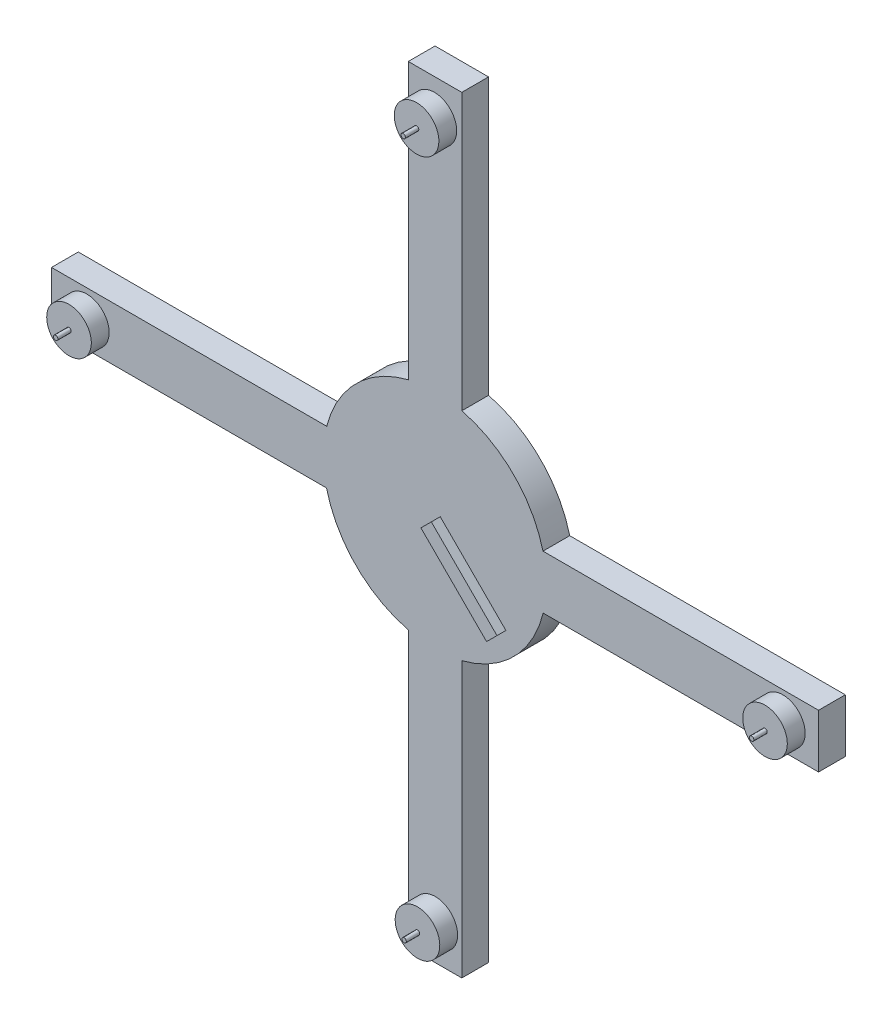
ISO-10303-21;
HEADER;
FILE_DESCRIPTION(('STEP AP214'),'2;1');
FILE_NAME('part.step','',(''),(''),'','','');
FILE_SCHEMA(('AUTOMOTIVE_DESIGN { 1 0 10303 214 1 1 1 1 }'));
ENDSEC;
DATA;
#1=APPLICATION_CONTEXT('core data for automotive mechanical design processes');
#2=APPLICATION_PROTOCOL_DEFINITION('international standard','automotive_design',2000,#1);
#3=PRODUCT_CONTEXT('',#1,'mechanical');
#4=PRODUCT('Part','Part','',(#3));
#5=PRODUCT_RELATED_PRODUCT_CATEGORY('part','',(#4));
#6=PRODUCT_DEFINITION_FORMATION('','',#4);
#7=PRODUCT_DEFINITION_CONTEXT('part definition',#1,'design');
#8=PRODUCT_DEFINITION('design','',#6,#7);
#9=PRODUCT_DEFINITION_SHAPE('','',#8);
#10=(LENGTH_UNIT() NAMED_UNIT(*) SI_UNIT(.MILLI.,.METRE.));
#11=(NAMED_UNIT(*) PLANE_ANGLE_UNIT() SI_UNIT($,.RADIAN.));
#12=(NAMED_UNIT(*) SI_UNIT($,.STERADIAN.) SOLID_ANGLE_UNIT());
#13=UNCERTAINTY_MEASURE_WITH_UNIT(LENGTH_MEASURE(1.E-05),#10,'distance_accuracy_value','');
#14=(GEOMETRIC_REPRESENTATION_CONTEXT(3) GLOBAL_UNCERTAINTY_ASSIGNED_CONTEXT((#13)) GLOBAL_UNIT_ASSIGNED_CONTEXT((#10,
#11,#12)) REPRESENTATION_CONTEXT('',''));
#15=CARTESIAN_POINT('',(0.,0.,0.));
#16=DIRECTION('',(0.,0.,1.));
#17=DIRECTION('',(1.,0.,0.));
#18=AXIS2_PLACEMENT_3D('',#15,#16,#17);
#19=CARTESIAN_POINT('',(0.,0.,15.));
#20=DIRECTION('',(0.,0.,1.));
#21=DIRECTION('',(1.,0.,0.));
#22=AXIS2_PLACEMENT_3D('',#19,#20,#21);
#23=PLANE('',#22);
#24=CARTESIAN_POINT('',(0.308153891719877,-390.724079491612,15.));
#25=DIRECTION('',(0.,0.,1.));
#26=DIRECTION('',(0.,-1.,0.));
#27=AXIS2_PLACEMENT_3D('',#24,#25,#26);
#28=CIRCLE('',#27,25.);
#29=CARTESIAN_POINT('',(0.308153891720139,-415.724079491612,15.));
#30=VERTEX_POINT('',#29);
#31=EDGE_CURVE('E218',#30,#30,#28,.T.);
#32=ORIENTED_EDGE('',*,*,#31,.F.);
#33=EDGE_LOOP('',(#32));
#34=FACE_BOUND('',#33,.T.);
#35=CARTESIAN_POINT('',(-390.415925599896,-1.03223338332725,15.));
#36=DIRECTION('',(0.,0.,1.));
#37=DIRECTION('',(-1.,0.,0.));
#38=AXIS2_PLACEMENT_3D('',#35,#36,#37);
#39=CIRCLE('',#38,25.);
#40=CARTESIAN_POINT('',(-415.415925599896,-1.03223338332725,15.));
#41=VERTEX_POINT('',#40);
#42=EDGE_CURVE('E224',#41,#41,#39,.T.);
#43=ORIENTED_EDGE('',*,*,#42,.F.);
#44=EDGE_LOOP('',(#43));
#45=FACE_BOUND('',#44,.T.);
#46=CARTESIAN_POINT('',(-0.724079491612825,389.691846108284,15.));
#47=DIRECTION('',(0.,0.,1.));
#48=DIRECTION('',(0.,1.,0.));
#49=AXIS2_PLACEMENT_3D('',#46,#47,#48);
#50=CIRCLE('',#49,25.);
#51=CARTESIAN_POINT('',(-0.724079491612912,414.691846108284,15.));
#52=VERTEX_POINT('',#51);
#53=EDGE_CURVE('E230',#52,#52,#50,.T.);
#54=ORIENTED_EDGE('',*,*,#53,.F.);
#55=EDGE_LOOP('',(#54));
#56=FACE_BOUND('',#55,.T.);
#57=CARTESIAN_POINT('',(390.,0.,15.));
#58=DIRECTION('',(0.,0.,1.));
#59=DIRECTION('',(1.,0.,0.));
#60=AXIS2_PLACEMENT_3D('',#57,#58,#59);
#61=CIRCLE('',#60,25.);
#62=CARTESIAN_POINT('',(415.,0.,15.));
#63=VERTEX_POINT('',#62);
#64=EDGE_CURVE('E242',#63,#63,#61,.T.);
#65=ORIENTED_EDGE('',*,*,#64,.F.);
#66=EDGE_LOOP('',(#65));
#67=FACE_BOUND('',#66,.T.);
#68=CARTESIAN_POINT('',(-0.207962799947836,-0.516116691663626,15.));
#69=DIRECTION('',(0.,0.,1.));
#70=DIRECTION('',(1.,0.,0.));
#71=AXIS2_PLACEMENT_3D('',#68,#69,#70);
#72=CIRCLE('',#71,125.);
#73=CARTESIAN_POINT('',(-121.681007649661,-30.,15.));
#74=VERTEX_POINT('',#73);
#75=CARTESIAN_POINT('',(-30.,-121.91395241978,15.));
#76=VERTEX_POINT('',#75);
#77=EDGE_CURVE('E248',#74,#76,#72,.T.);
#78=ORIENTED_EDGE('',*,*,#77,.T.);
#79=DIRECTION('',(0.,1.,0.));
#80=VECTOR('',#79,1.);
#81=CARTESIAN_POINT('',(-30.,0.,15.));
#82=LINE('',#81,#80);
#83=CARTESIAN_POINT('',(-30.,-430.,15.));
#84=VERTEX_POINT('',#83);
#85=EDGE_CURVE('E253',#84,#76,#82,.T.);
#86=ORIENTED_EDGE('',*,*,#85,.F.);
#87=DIRECTION('',(-1.,0.,0.));
#88=VECTOR('',#87,1.);
#89=CARTESIAN_POINT('',(0.,-430.,15.));
#90=LINE('',#89,#88);
#91=CARTESIAN_POINT('',(30.,-430.,15.));
#92=VERTEX_POINT('',#91);
#93=EDGE_CURVE('E256',#92,#84,#90,.T.);
#94=ORIENTED_EDGE('',*,*,#93,.F.);
#95=DIRECTION('',(0.,-1.,0.));
#96=VECTOR('',#95,1.);
#97=CARTESIAN_POINT('',(30.,0.,15.));
#98=LINE('',#97,#96);
#99=CARTESIAN_POINT('',(30.,-121.811124764861,15.));
#100=VERTEX_POINT('',#99);
#101=EDGE_CURVE('E259',#100,#92,#98,.T.);
#102=ORIENTED_EDGE('',*,*,#101,.F.);
#103=CARTESIAN_POINT('',(-0.207962799947836,-0.516116691663626,15.));
#104=DIRECTION('',(0.,0.,1.));
#105=DIRECTION('',(1.,0.,0.));
#106=AXIS2_PLACEMENT_3D('',#103,#104,#105);
#107=CIRCLE('',#106,125.);
#108=CARTESIAN_POINT('',(121.265082049765,-30.,15.));
#109=VERTEX_POINT('',#108);
#110=EDGE_CURVE('E262',#100,#109,#107,.T.);
#111=ORIENTED_EDGE('',*,*,#110,.T.);
#112=DIRECTION('',(-1.,0.,0.));
#113=VECTOR('',#112,1.);
#114=CARTESIAN_POINT('',(0.,-30.,15.));
#115=LINE('',#114,#113);
#116=CARTESIAN_POINT('',(430.,-30.,15.));
#117=VERTEX_POINT('',#116);
#118=EDGE_CURVE('E265',#117,#109,#115,.T.);
#119=ORIENTED_EDGE('',*,*,#118,.F.);
#120=DIRECTION('',(0.,-1.,0.));
#121=VECTOR('',#120,1.);
#122=CARTESIAN_POINT('',(430.,0.,15.));
#123=LINE('',#122,#121);
#124=CARTESIAN_POINT('',(430.,30.,15.));
#125=VERTEX_POINT('',#124);
#126=EDGE_CURVE('E268',#125,#117,#123,.T.);
#127=ORIENTED_EDGE('',*,*,#126,.F.);
#128=DIRECTION('',(1.,0.,0.));
#129=VECTOR('',#128,1.);
#130=CARTESIAN_POINT('',(0.,30.,15.));
#131=LINE('',#130,#129);
#132=CARTESIAN_POINT('',(121.00988498684,30.,15.));
#133=VERTEX_POINT('',#132);
#134=EDGE_CURVE('E271',#133,#125,#131,.T.);
#135=ORIENTED_EDGE('',*,*,#134,.F.);
#136=CARTESIAN_POINT('',(-0.207962799947836,-0.516116691663626,15.));
#137=DIRECTION('',(0.,0.,1.));
#138=DIRECTION('',(1.,0.,0.));
#139=AXIS2_PLACEMENT_3D('',#136,#137,#138);
#140=CIRCLE('',#139,125.);
#141=CARTESIAN_POINT('',(30.,120.778891381534,15.));
#142=VERTEX_POINT('',#141);
#143=EDGE_CURVE('E274',#133,#142,#140,.T.);
#144=ORIENTED_EDGE('',*,*,#143,.T.);
#145=DIRECTION('',(0.,-1.,0.));
#146=VECTOR('',#145,1.);
#147=CARTESIAN_POINT('',(30.,0.,15.));
#148=LINE('',#147,#146);
#149=CARTESIAN_POINT('',(30.,430.,15.));
#150=VERTEX_POINT('',#149);
#151=EDGE_CURVE('E277',#150,#142,#148,.T.);
#152=ORIENTED_EDGE('',*,*,#151,.F.);
#153=DIRECTION('',(1.,0.,0.));
#154=VECTOR('',#153,1.);
#155=CARTESIAN_POINT('',(0.,430.,15.));
#156=LINE('',#155,#154);
#157=CARTESIAN_POINT('',(-30.,430.,15.));
#158=VERTEX_POINT('',#157);
#159=EDGE_CURVE('E280',#158,#150,#156,.T.);
#160=ORIENTED_EDGE('',*,*,#159,.F.);
#161=DIRECTION('',(0.,1.,0.));
#162=VECTOR('',#161,1.);
#163=CARTESIAN_POINT('',(-30.,0.,15.));
#164=LINE('',#163,#162);
#165=CARTESIAN_POINT('',(-30.,120.881719036453,15.));
#166=VERTEX_POINT('',#165);
#167=EDGE_CURVE('E283',#166,#158,#164,.T.);
#168=ORIENTED_EDGE('',*,*,#167,.F.);
#169=CARTESIAN_POINT('',(-0.207962799947836,-0.516116691663626,15.));
#170=DIRECTION('',(0.,0.,1.));
#171=DIRECTION('',(1.,0.,0.));
#172=AXIS2_PLACEMENT_3D('',#169,#170,#171);
#173=CIRCLE('',#172,125.);
#174=CARTESIAN_POINT('',(-121.425810586735,30.,15.));
#175=VERTEX_POINT('',#174);
#176=EDGE_CURVE('E286',#166,#175,#173,.T.);
#177=ORIENTED_EDGE('',*,*,#176,.T.);
#178=DIRECTION('',(1.,0.,0.));
#179=VECTOR('',#178,1.);
#180=CARTESIAN_POINT('',(0.,30.,15.));
#181=LINE('',#180,#179);
#182=CARTESIAN_POINT('',(-430.,30.,15.));
#183=VERTEX_POINT('',#182);
#184=EDGE_CURVE('E289',#183,#175,#181,.T.);
#185=ORIENTED_EDGE('',*,*,#184,.F.);
#186=DIRECTION('',(0.,1.,0.));
#187=VECTOR('',#186,1.);
#188=CARTESIAN_POINT('',(-430.,0.,15.));
#189=LINE('',#188,#187);
#190=CARTESIAN_POINT('',(-430.,-30.,15.));
#191=VERTEX_POINT('',#190);
#192=EDGE_CURVE('E292',#191,#183,#189,.T.);
#193=ORIENTED_EDGE('',*,*,#192,.F.);
#194=DIRECTION('',(-1.,0.,0.));
#195=VECTOR('',#194,1.);
#196=CARTESIAN_POINT('',(0.,-30.,15.));
#197=LINE('',#196,#195);
#198=EDGE_CURVE('E295',#74,#191,#197,.T.);
#199=ORIENTED_EDGE('',*,*,#198,.F.);
#200=EDGE_LOOP('',(#78,#86,#94,#102,#111,#119,#127,#135,#144,#152,#160,#168,#177,#185,#193,#199));
#201=FACE_BOUND('',#200,.T.);
#202=DIRECTION('',(0.707106781186551,-0.707106781186544,0.));
#203=VECTOR('',#202,1.);
#204=CARTESIAN_POINT('',(-5.83466475817812,-5.83466475817819,15.));
#205=LINE('',#204,#203);
#206=CARTESIAN_POINT('',(-5.83466475817812,-5.83466475817819,15.));
#207=VERTEX_POINT('',#206);
#208=CARTESIAN_POINT('',(67.7881231764963,-79.4574526928518,15.));
#209=VERTEX_POINT('',#208);
#210=EDGE_CURVE('E714',#207,#209,#205,.T.);
#211=ORIENTED_EDGE('',*,*,#210,.F.);
#212=DIRECTION('',(-0.707106781186543,-0.707106781186552,0.));
#213=VECTOR('',#212,1.);
#214=CARTESIAN_POINT('',(-5.83466475817812,-5.83466475817819,15.));
#215=LINE('',#214,#213);
#216=CARTESIAN_POINT('',(5.83466475817812,5.83466475817819,15.));
#217=VERTEX_POINT('',#216);
#218=EDGE_CURVE('E196',#217,#207,#215,.T.);
#219=ORIENTED_EDGE('',*,*,#218,.F.);
#220=DIRECTION('',(-0.707106781186552,0.707106781186543,0.));
#221=VECTOR('',#220,1.);
#222=CARTESIAN_POINT('',(5.83466475817812,5.83466475817819,15.));
#223=LINE('',#222,#221);
#224=CARTESIAN_POINT('',(79.4574526928526,-67.7881231764954,15.));
#225=VERTEX_POINT('',#224);
#226=EDGE_CURVE('E192',#225,#217,#223,.T.);
#227=ORIENTED_EDGE('',*,*,#226,.F.);
#228=DIRECTION('',(0.707106781186543,0.707106781186552,0.));
#229=VECTOR('',#228,1.);
#230=CARTESIAN_POINT('',(67.7881231764963,-79.4574526928518,15.));
#231=LINE('',#230,#229);
#232=EDGE_CURVE('E711',#209,#225,#231,.T.);
#233=ORIENTED_EDGE('',*,*,#232,.F.);
#234=EDGE_LOOP('',(#211,#219,#227,#233));
#235=FACE_BOUND('',#234,.T.);
#236=ADVANCED_FACE('F35',(#34,#45,#56,#67,#201,#235),#23,.T.);
#237=CARTESIAN_POINT('',(-0.207962799947836,-0.516116691663626,-15.));
#238=DIRECTION('',(0.,0.,1.));
#239=DIRECTION('',(1.,0.,0.));
#240=AXIS2_PLACEMENT_3D('',#237,#238,#239);
#241=CYLINDRICAL_SURFACE('',#240,125.);
#242=DIRECTION('',(0.,0.,1.));
#243=VECTOR('',#242,1.);
#244=CARTESIAN_POINT('',(-30.,-121.91395241978,-15.));
#245=LINE('',#244,#243);
#246=CARTESIAN_POINT('',(-30.,-121.91395241978,-15.));
#247=VERTEX_POINT('',#246);
#248=EDGE_CURVE('E39',#247,#76,#245,.T.);
#249=ORIENTED_EDGE('',*,*,#248,.T.);
#250=ORIENTED_EDGE('',*,*,#77,.F.);
#251=DIRECTION('',(0.,0.,1.));
#252=VECTOR('',#251,1.);
#253=CARTESIAN_POINT('',(-121.681007649661,-30.,-15.));
#254=LINE('',#253,#252);
#255=CARTESIAN_POINT('',(-121.681007649661,-30.,-15.));
#256=VERTEX_POINT('',#255);
#257=EDGE_CURVE('E11',#256,#74,#254,.T.);
#258=ORIENTED_EDGE('',*,*,#257,.F.);
#259=CARTESIAN_POINT('',(-0.207962799947836,-0.516116691663626,-15.));
#260=DIRECTION('',(0.,0.,1.));
#261=DIRECTION('',(1.,0.,0.));
#262=AXIS2_PLACEMENT_3D('',#259,#260,#261);
#263=CIRCLE('',#262,125.);
#264=EDGE_CURVE('E298',#256,#247,#263,.T.);
#265=ORIENTED_EDGE('',*,*,#264,.T.);
#266=EDGE_LOOP('',(#249,#250,#258,#265));
#267=FACE_BOUND('',#266,.T.);
#268=ADVANCED_FACE('F37',(#267),#241,.T.);
#269=CARTESIAN_POINT('',(0.,-30.,-15.));
#270=DIRECTION('',(0.,1.,0.));
#271=DIRECTION('',(0.,0.,1.));
#272=AXIS2_PLACEMENT_3D('',#269,#270,#271);
#273=PLANE('',#272);
#274=ORIENTED_EDGE('',*,*,#257,.T.);
#275=ORIENTED_EDGE('',*,*,#198,.T.);
#276=DIRECTION('',(0.,0.,1.));
#277=VECTOR('',#276,1.);
#278=CARTESIAN_POINT('',(-430.,-30.,-15.));
#279=LINE('',#278,#277);
#280=CARTESIAN_POINT('',(-430.,-30.,-15.));
#281=VERTEX_POINT('',#280);
#282=EDGE_CURVE('E44',#281,#191,#279,.T.);
#283=ORIENTED_EDGE('',*,*,#282,.F.);
#284=DIRECTION('',(-1.,0.,0.));
#285=VECTOR('',#284,1.);
#286=CARTESIAN_POINT('',(0.,-30.,-15.));
#287=LINE('',#286,#285);
#288=EDGE_CURVE('E331',#256,#281,#287,.T.);
#289=ORIENTED_EDGE('',*,*,#288,.F.);
#290=EDGE_LOOP('',(#274,#275,#283,#289));
#291=FACE_BOUND('',#290,.T.);
#292=ADVANCED_FACE('F389',(#291),#273,.F.);
#293=CARTESIAN_POINT('',(-430.,0.,-15.));
#294=DIRECTION('',(1.,0.,0.));
#295=DIRECTION('',(0.,0.,-1.));
#296=AXIS2_PLACEMENT_3D('',#293,#294,#295);
#297=PLANE('',#296);
#298=ORIENTED_EDGE('',*,*,#282,.T.);
#299=ORIENTED_EDGE('',*,*,#192,.T.);
#300=DIRECTION('',(0.,0.,1.));
#301=VECTOR('',#300,1.);
#302=CARTESIAN_POINT('',(-430.,30.,-15.));
#303=LINE('',#302,#301);
#304=CARTESIAN_POINT('',(-430.,30.,-15.));
#305=VERTEX_POINT('',#304);
#306=EDGE_CURVE('E334',#305,#183,#303,.T.);
#307=ORIENTED_EDGE('',*,*,#306,.F.);
#308=DIRECTION('',(0.,1.,0.));
#309=VECTOR('',#308,1.);
#310=CARTESIAN_POINT('',(-430.,0.,-15.));
#311=LINE('',#310,#309);
#312=EDGE_CURVE('E329',#281,#305,#311,.T.);
#313=ORIENTED_EDGE('',*,*,#312,.F.);
#314=EDGE_LOOP('',(#298,#299,#307,#313));
#315=FACE_BOUND('',#314,.T.);
#316=ADVANCED_FACE('F397',(#315),#297,.F.);
#317=CARTESIAN_POINT('',(0.,30.,-15.));
#318=DIRECTION('',(0.,-1.,0.));
#319=DIRECTION('',(0.,0.,-1.));
#320=AXIS2_PLACEMENT_3D('',#317,#318,#319);
#321=PLANE('',#320);
#322=ORIENTED_EDGE('',*,*,#306,.T.);
#323=ORIENTED_EDGE('',*,*,#184,.T.);
#324=DIRECTION('',(0.,0.,1.));
#325=VECTOR('',#324,1.);
#326=CARTESIAN_POINT('',(-121.425810586735,30.,-15.));
#327=LINE('',#326,#325);
#328=CARTESIAN_POINT('',(-121.425810586735,30.,-15.));
#329=VERTEX_POINT('',#328);
#330=EDGE_CURVE('E336',#329,#175,#327,.T.);
#331=ORIENTED_EDGE('',*,*,#330,.F.);
#332=DIRECTION('',(1.,0.,0.));
#333=VECTOR('',#332,1.);
#334=CARTESIAN_POINT('',(0.,30.,-15.));
#335=LINE('',#334,#333);
#336=EDGE_CURVE('E327',#305,#329,#335,.T.);
#337=ORIENTED_EDGE('',*,*,#336,.F.);
#338=EDGE_LOOP('',(#322,#323,#331,#337));
#339=FACE_BOUND('',#338,.T.);
#340=ADVANCED_FACE('F401',(#339),#321,.F.);
#341=CARTESIAN_POINT('',(-0.207962799947836,-0.516116691663626,-15.));
#342=DIRECTION('',(0.,0.,1.));
#343=DIRECTION('',(1.,0.,0.));
#344=AXIS2_PLACEMENT_3D('',#341,#342,#343);
#345=CYLINDRICAL_SURFACE('',#344,125.);
#346=ORIENTED_EDGE('',*,*,#330,.T.);
#347=ORIENTED_EDGE('',*,*,#176,.F.);
#348=DIRECTION('',(0.,0.,1.));
#349=VECTOR('',#348,1.);
#350=CARTESIAN_POINT('',(-30.,120.881719036453,-15.));
#351=LINE('',#350,#349);
#352=CARTESIAN_POINT('',(-30.,120.881719036453,-15.));
#353=VERTEX_POINT('',#352);
#354=EDGE_CURVE('E338',#353,#166,#351,.T.);
#355=ORIENTED_EDGE('',*,*,#354,.F.);
#356=CARTESIAN_POINT('',(-0.207962799947836,-0.516116691663626,-15.));
#357=DIRECTION('',(0.,0.,1.));
#358=DIRECTION('',(1.,0.,0.));
#359=AXIS2_PLACEMENT_3D('',#356,#357,#358);
#360=CIRCLE('',#359,125.);
#361=EDGE_CURVE('E324',#353,#329,#360,.T.);
#362=ORIENTED_EDGE('',*,*,#361,.T.);
#363=EDGE_LOOP('',(#346,#347,#355,#362));
#364=FACE_BOUND('',#363,.T.);
#365=ADVANCED_FACE('F405',(#364),#345,.T.);
#366=CARTESIAN_POINT('',(-30.,0.,-15.));
#367=DIRECTION('',(1.,0.,0.));
#368=DIRECTION('',(0.,0.,-1.));
#369=AXIS2_PLACEMENT_3D('',#366,#367,#368);
#370=PLANE('',#369);
#371=ORIENTED_EDGE('',*,*,#354,.T.);
#372=ORIENTED_EDGE('',*,*,#167,.T.);
#373=DIRECTION('',(0.,0.,1.));
#374=VECTOR('',#373,1.);
#375=CARTESIAN_POINT('',(-30.,430.,-15.));
#376=LINE('',#375,#374);
#377=CARTESIAN_POINT('',(-30.,430.,-15.));
#378=VERTEX_POINT('',#377);
#379=EDGE_CURVE('E340',#378,#158,#376,.T.);
#380=ORIENTED_EDGE('',*,*,#379,.F.);
#381=DIRECTION('',(0.,1.,0.));
#382=VECTOR('',#381,1.);
#383=CARTESIAN_POINT('',(-30.,0.,-15.));
#384=LINE('',#383,#382);
#385=EDGE_CURVE('E322',#353,#378,#384,.T.);
#386=ORIENTED_EDGE('',*,*,#385,.F.);
#387=EDGE_LOOP('',(#371,#372,#380,#386));
#388=FACE_BOUND('',#387,.T.);
#389=ADVANCED_FACE('F409',(#388),#370,.F.);
#390=CARTESIAN_POINT('',(0.,430.,-15.));
#391=DIRECTION('',(0.,-1.,0.));
#392=DIRECTION('',(0.,0.,-1.));
#393=AXIS2_PLACEMENT_3D('',#390,#391,#392);
#394=PLANE('',#393);
#395=ORIENTED_EDGE('',*,*,#379,.T.);
#396=ORIENTED_EDGE('',*,*,#159,.T.);
#397=DIRECTION('',(0.,0.,1.));
#398=VECTOR('',#397,1.);
#399=CARTESIAN_POINT('',(30.,430.,-15.));
#400=LINE('',#399,#398);
#401=CARTESIAN_POINT('',(30.,430.,-15.));
#402=VERTEX_POINT('',#401);
#403=EDGE_CURVE('E342',#402,#150,#400,.T.);
#404=ORIENTED_EDGE('',*,*,#403,.F.);
#405=DIRECTION('',(1.,0.,0.));
#406=VECTOR('',#405,1.);
#407=CARTESIAN_POINT('',(0.,430.,-15.));
#408=LINE('',#407,#406);
#409=EDGE_CURVE('E320',#378,#402,#408,.T.);
#410=ORIENTED_EDGE('',*,*,#409,.F.);
#411=EDGE_LOOP('',(#395,#396,#404,#410));
#412=FACE_BOUND('',#411,.T.);
#413=ADVANCED_FACE('F413',(#412),#394,.F.);
#414=CARTESIAN_POINT('',(30.,0.,-15.));
#415=DIRECTION('',(-1.,0.,0.));
#416=DIRECTION('',(0.,0.,1.));
#417=AXIS2_PLACEMENT_3D('',#414,#415,#416);
#418=PLANE('',#417);
#419=ORIENTED_EDGE('',*,*,#403,.T.);
#420=ORIENTED_EDGE('',*,*,#151,.T.);
#421=DIRECTION('',(0.,0.,1.));
#422=VECTOR('',#421,1.);
#423=CARTESIAN_POINT('',(30.,120.778891381534,-15.));
#424=LINE('',#423,#422);
#425=CARTESIAN_POINT('',(30.,120.778891381534,-15.));
#426=VERTEX_POINT('',#425);
#427=EDGE_CURVE('E344',#426,#142,#424,.T.);
#428=ORIENTED_EDGE('',*,*,#427,.F.);
#429=DIRECTION('',(0.,-1.,0.));
#430=VECTOR('',#429,1.);
#431=CARTESIAN_POINT('',(30.,0.,-15.));
#432=LINE('',#431,#430);
#433=EDGE_CURVE('E318',#402,#426,#432,.T.);
#434=ORIENTED_EDGE('',*,*,#433,.F.);
#435=EDGE_LOOP('',(#419,#420,#428,#434));
#436=FACE_BOUND('',#435,.T.);
#437=ADVANCED_FACE('F417',(#436),#418,.F.);
#438=CARTESIAN_POINT('',(-0.207962799947836,-0.516116691663626,-15.));
#439=DIRECTION('',(0.,0.,1.));
#440=DIRECTION('',(1.,0.,0.));
#441=AXIS2_PLACEMENT_3D('',#438,#439,#440);
#442=CYLINDRICAL_SURFACE('',#441,125.);
#443=ORIENTED_EDGE('',*,*,#427,.T.);
#444=ORIENTED_EDGE('',*,*,#143,.F.);
#445=DIRECTION('',(0.,0.,1.));
#446=VECTOR('',#445,1.);
#447=CARTESIAN_POINT('',(121.00988498684,30.,-15.));
#448=LINE('',#447,#446);
#449=CARTESIAN_POINT('',(121.00988498684,30.,-15.));
#450=VERTEX_POINT('',#449);
#451=EDGE_CURVE('E346',#450,#133,#448,.T.);
#452=ORIENTED_EDGE('',*,*,#451,.F.);
#453=CARTESIAN_POINT('',(-0.207962799947836,-0.516116691663626,-15.));
#454=DIRECTION('',(0.,0.,1.));
#455=DIRECTION('',(1.,0.,0.));
#456=AXIS2_PLACEMENT_3D('',#453,#454,#455);
#457=CIRCLE('',#456,125.);
#458=EDGE_CURVE('E315',#450,#426,#457,.T.);
#459=ORIENTED_EDGE('',*,*,#458,.T.);
#460=EDGE_LOOP('',(#443,#444,#452,#459));
#461=FACE_BOUND('',#460,.T.);
#462=ADVANCED_FACE('F421',(#461),#442,.T.);
#463=CARTESIAN_POINT('',(0.,30.,-15.));
#464=DIRECTION('',(0.,-1.,0.));
#465=DIRECTION('',(0.,0.,-1.));
#466=AXIS2_PLACEMENT_3D('',#463,#464,#465);
#467=PLANE('',#466);
#468=ORIENTED_EDGE('',*,*,#451,.T.);
#469=ORIENTED_EDGE('',*,*,#134,.T.);
#470=DIRECTION('',(0.,0.,1.));
#471=VECTOR('',#470,1.);
#472=CARTESIAN_POINT('',(430.,30.,-15.));
#473=LINE('',#472,#471);
#474=CARTESIAN_POINT('',(430.,30.,-15.));
#475=VERTEX_POINT('',#474);
#476=EDGE_CURVE('E348',#475,#125,#473,.T.);
#477=ORIENTED_EDGE('',*,*,#476,.F.);
#478=DIRECTION('',(1.,0.,0.));
#479=VECTOR('',#478,1.);
#480=CARTESIAN_POINT('',(0.,30.,-15.));
#481=LINE('',#480,#479);
#482=EDGE_CURVE('E313',#450,#475,#481,.T.);
#483=ORIENTED_EDGE('',*,*,#482,.F.);
#484=EDGE_LOOP('',(#468,#469,#477,#483));
#485=FACE_BOUND('',#484,.T.);
#486=ADVANCED_FACE('F425',(#485),#467,.F.);
#487=CARTESIAN_POINT('',(430.,0.,-15.));
#488=DIRECTION('',(-1.,0.,0.));
#489=DIRECTION('',(0.,0.,1.));
#490=AXIS2_PLACEMENT_3D('',#487,#488,#489);
#491=PLANE('',#490);
#492=ORIENTED_EDGE('',*,*,#476,.T.);
#493=ORIENTED_EDGE('',*,*,#126,.T.);
#494=DIRECTION('',(0.,0.,1.));
#495=VECTOR('',#494,1.);
#496=CARTESIAN_POINT('',(430.,-30.,-15.));
#497=LINE('',#496,#495);
#498=CARTESIAN_POINT('',(430.,-30.,-15.));
#499=VERTEX_POINT('',#498);
#500=EDGE_CURVE('E350',#499,#117,#497,.T.);
#501=ORIENTED_EDGE('',*,*,#500,.F.);
#502=DIRECTION('',(0.,-1.,0.));
#503=VECTOR('',#502,1.);
#504=CARTESIAN_POINT('',(430.,0.,-15.));
#505=LINE('',#504,#503);
#506=EDGE_CURVE('E311',#475,#499,#505,.T.);
#507=ORIENTED_EDGE('',*,*,#506,.F.);
#508=EDGE_LOOP('',(#492,#493,#501,#507));
#509=FACE_BOUND('',#508,.T.);
#510=ADVANCED_FACE('F429',(#509),#491,.F.);
#511=CARTESIAN_POINT('',(0.,-30.,-15.));
#512=DIRECTION('',(0.,1.,0.));
#513=DIRECTION('',(0.,0.,1.));
#514=AXIS2_PLACEMENT_3D('',#511,#512,#513);
#515=PLANE('',#514);
#516=ORIENTED_EDGE('',*,*,#500,.T.);
#517=ORIENTED_EDGE('',*,*,#118,.T.);
#518=DIRECTION('',(0.,0.,1.));
#519=VECTOR('',#518,1.);
#520=CARTESIAN_POINT('',(121.265082049765,-30.,-15.));
#521=LINE('',#520,#519);
#522=CARTESIAN_POINT('',(121.265082049765,-30.,-15.));
#523=VERTEX_POINT('',#522);
#524=EDGE_CURVE('E352',#523,#109,#521,.T.);
#525=ORIENTED_EDGE('',*,*,#524,.F.);
#526=DIRECTION('',(-1.,0.,0.));
#527=VECTOR('',#526,1.);
#528=CARTESIAN_POINT('',(0.,-30.,-15.));
#529=LINE('',#528,#527);
#530=EDGE_CURVE('E309',#499,#523,#529,.T.);
#531=ORIENTED_EDGE('',*,*,#530,.F.);
#532=EDGE_LOOP('',(#516,#517,#525,#531));
#533=FACE_BOUND('',#532,.T.);
#534=ADVANCED_FACE('F433',(#533),#515,.F.);
#535=CARTESIAN_POINT('',(-0.207962799947836,-0.516116691663626,-15.));
#536=DIRECTION('',(0.,0.,1.));
#537=DIRECTION('',(1.,0.,0.));
#538=AXIS2_PLACEMENT_3D('',#535,#536,#537);
#539=CYLINDRICAL_SURFACE('',#538,125.);
#540=ORIENTED_EDGE('',*,*,#524,.T.);
#541=ORIENTED_EDGE('',*,*,#110,.F.);
#542=DIRECTION('',(0.,0.,1.));
#543=VECTOR('',#542,1.);
#544=CARTESIAN_POINT('',(30.,-121.811124764861,-15.));
#545=LINE('',#544,#543);
#546=CARTESIAN_POINT('',(30.,-121.811124764861,-15.));
#547=VERTEX_POINT('',#546);
#548=EDGE_CURVE('E354',#547,#100,#545,.T.);
#549=ORIENTED_EDGE('',*,*,#548,.F.);
#550=CARTESIAN_POINT('',(-0.207962799947836,-0.516116691663626,-15.));
#551=DIRECTION('',(0.,0.,1.));
#552=DIRECTION('',(1.,0.,0.));
#553=AXIS2_PLACEMENT_3D('',#550,#551,#552);
#554=CIRCLE('',#553,125.);
#555=EDGE_CURVE('E306',#547,#523,#554,.T.);
#556=ORIENTED_EDGE('',*,*,#555,.T.);
#557=EDGE_LOOP('',(#540,#541,#549,#556));
#558=FACE_BOUND('',#557,.T.);
#559=ADVANCED_FACE('F437',(#558),#539,.T.);
#560=CARTESIAN_POINT('',(30.,0.,-15.));
#561=DIRECTION('',(-1.,0.,0.));
#562=DIRECTION('',(0.,0.,1.));
#563=AXIS2_PLACEMENT_3D('',#560,#561,#562);
#564=PLANE('',#563);
#565=ORIENTED_EDGE('',*,*,#548,.T.);
#566=ORIENTED_EDGE('',*,*,#101,.T.);
#567=DIRECTION('',(0.,0.,1.));
#568=VECTOR('',#567,1.);
#569=CARTESIAN_POINT('',(30.,-430.,-15.));
#570=LINE('',#569,#568);
#571=CARTESIAN_POINT('',(30.,-430.,-15.));
#572=VERTEX_POINT('',#571);
#573=EDGE_CURVE('E356',#572,#92,#570,.T.);
#574=ORIENTED_EDGE('',*,*,#573,.F.);
#575=DIRECTION('',(0.,-1.,0.));
#576=VECTOR('',#575,1.);
#577=CARTESIAN_POINT('',(30.,0.,-15.));
#578=LINE('',#577,#576);
#579=EDGE_CURVE('E304',#547,#572,#578,.T.);
#580=ORIENTED_EDGE('',*,*,#579,.F.);
#581=EDGE_LOOP('',(#565,#566,#574,#580));
#582=FACE_BOUND('',#581,.T.);
#583=ADVANCED_FACE('F380',(#582),#564,.F.);
#584=CARTESIAN_POINT('',(0.,-430.,-15.));
#585=DIRECTION('',(0.,1.,0.));
#586=DIRECTION('',(0.,0.,1.));
#587=AXIS2_PLACEMENT_3D('',#584,#585,#586);
#588=PLANE('',#587);
#589=ORIENTED_EDGE('',*,*,#573,.T.);
#590=ORIENTED_EDGE('',*,*,#93,.T.);
#591=DIRECTION('',(0.,0.,1.));
#592=VECTOR('',#591,1.);
#593=CARTESIAN_POINT('',(-30.,-430.,-15.));
#594=LINE('',#593,#592);
#595=CARTESIAN_POINT('',(-30.,-430.,-15.));
#596=VERTEX_POINT('',#595);
#597=EDGE_CURVE('E357',#596,#84,#594,.T.);
#598=ORIENTED_EDGE('',*,*,#597,.F.);
#599=DIRECTION('',(-1.,0.,0.));
#600=VECTOR('',#599,1.);
#601=CARTESIAN_POINT('',(0.,-430.,-15.));
#602=LINE('',#601,#600);
#603=EDGE_CURVE('E302',#572,#596,#602,.T.);
#604=ORIENTED_EDGE('',*,*,#603,.F.);
#605=EDGE_LOOP('',(#589,#590,#598,#604));
#606=FACE_BOUND('',#605,.T.);
#607=ADVANCED_FACE('F372',(#606),#588,.F.);
#608=CARTESIAN_POINT('',(-30.,0.,-15.));
#609=DIRECTION('',(1.,0.,0.));
#610=DIRECTION('',(0.,0.,-1.));
#611=AXIS2_PLACEMENT_3D('',#608,#609,#610);
#612=PLANE('',#611);
#613=ORIENTED_EDGE('',*,*,#597,.T.);
#614=ORIENTED_EDGE('',*,*,#85,.T.);
#615=ORIENTED_EDGE('',*,*,#248,.F.);
#616=DIRECTION('',(0.,1.,0.));
#617=VECTOR('',#616,1.);
#618=CARTESIAN_POINT('',(-30.,0.,-15.));
#619=LINE('',#618,#617);
#620=EDGE_CURVE('E300',#596,#247,#619,.T.);
#621=ORIENTED_EDGE('',*,*,#620,.F.);
#622=EDGE_LOOP('',(#613,#614,#615,#621));
#623=FACE_BOUND('',#622,.T.);
#624=ADVANCED_FACE('F369',(#623),#612,.F.);
#625=CARTESIAN_POINT('',(0.,0.,-15.));
#626=DIRECTION('',(0.,0.,1.));
#627=DIRECTION('',(1.,0.,0.));
#628=AXIS2_PLACEMENT_3D('',#625,#626,#627);
#629=PLANE('',#628);
#630=ORIENTED_EDGE('',*,*,#264,.F.);
#631=ORIENTED_EDGE('',*,*,#288,.T.);
#632=ORIENTED_EDGE('',*,*,#312,.T.);
#633=ORIENTED_EDGE('',*,*,#336,.T.);
#634=ORIENTED_EDGE('',*,*,#361,.F.);
#635=ORIENTED_EDGE('',*,*,#385,.T.);
#636=ORIENTED_EDGE('',*,*,#409,.T.);
#637=ORIENTED_EDGE('',*,*,#433,.T.);
#638=ORIENTED_EDGE('',*,*,#458,.F.);
#639=ORIENTED_EDGE('',*,*,#482,.T.);
#640=ORIENTED_EDGE('',*,*,#506,.T.);
#641=ORIENTED_EDGE('',*,*,#530,.T.);
#642=ORIENTED_EDGE('',*,*,#555,.F.);
#643=ORIENTED_EDGE('',*,*,#579,.T.);
#644=ORIENTED_EDGE('',*,*,#603,.T.);
#645=ORIENTED_EDGE('',*,*,#620,.T.);
#646=EDGE_LOOP('',(#630,#631,#632,#633,#634,#635,#636,#637,#638,#639,#640,#641,#642,#643,#644,#645));
#647=FACE_BOUND('',#646,.T.);
#648=ADVANCED_FACE('F371',(#647),#629,.F.);
#649=CARTESIAN_POINT('',(390.,0.,35.));
#650=DIRECTION('',(0.,0.,-1.));
#651=DIRECTION('',(-1.,0.,0.));
#652=AXIS2_PLACEMENT_3D('',#649,#650,#651);
#653=CYLINDRICAL_SURFACE('',#652,25.);
#654=CARTESIAN_POINT('',(390.,0.,35.));
#655=DIRECTION('',(0.,0.,1.));
#656=DIRECTION('',(1.,0.,0.));
#657=AXIS2_PLACEMENT_3D('',#654,#655,#656);
#658=CIRCLE('',#657,25.);
#659=CARTESIAN_POINT('',(415.,0.,35.));
#660=VERTEX_POINT('',#659);
#661=EDGE_CURVE('E245',#660,#660,#658,.T.);
#662=ORIENTED_EDGE('',*,*,#661,.F.);
#663=EDGE_LOOP('',(#662));
#664=FACE_BOUND('',#663,.T.);
#665=ORIENTED_EDGE('',*,*,#64,.T.);
#666=EDGE_LOOP('',(#665));
#667=FACE_BOUND('',#666,.T.);
#668=ADVANCED_FACE('F377',(#664,#667),#653,.T.);
#669=CARTESIAN_POINT('',(390.,0.,35.));
#670=DIRECTION('',(0.,0.,1.));
#671=DIRECTION('',(1.,0.,0.));
#672=AXIS2_PLACEMENT_3D('',#669,#670,#671);
#673=PLANE('',#672);
#674=CARTESIAN_POINT('',(390.,0.,35.));
#675=DIRECTION('',(0.,0.,1.));
#676=DIRECTION('',(1.,0.,0.));
#677=AXIS2_PLACEMENT_3D('',#674,#675,#676);
#678=CIRCLE('',#677,2.50000000000002);
#679=CARTESIAN_POINT('',(392.5,0.,35.));
#680=VERTEX_POINT('',#679);
#681=EDGE_CURVE('E236',#680,#680,#678,.T.);
#682=ORIENTED_EDGE('',*,*,#681,.F.);
#683=EDGE_LOOP('',(#682));
#684=FACE_BOUND('',#683,.T.);
#685=ORIENTED_EDGE('',*,*,#661,.T.);
#686=EDGE_LOOP('',(#685));
#687=FACE_BOUND('',#686,.T.);
#688=ADVANCED_FACE('F507',(#684,#687),#673,.T.);
#689=CARTESIAN_POINT('',(390.,0.,50.));
#690=DIRECTION('',(0.,0.,-1.));
#691=DIRECTION('',(-1.,0.,0.));
#692=AXIS2_PLACEMENT_3D('',#689,#690,#691);
#693=CYLINDRICAL_SURFACE('',#692,2.50000000000002);
#694=CARTESIAN_POINT('',(390.,0.,50.));
#695=DIRECTION('',(0.,0.,1.));
#696=DIRECTION('',(1.,0.,0.));
#697=AXIS2_PLACEMENT_3D('',#694,#695,#696);
#698=CIRCLE('',#697,2.50000000000002);
#699=CARTESIAN_POINT('',(392.5,0.,50.));
#700=VERTEX_POINT('',#699);
#701=EDGE_CURVE('E239',#700,#700,#698,.T.);
#702=ORIENTED_EDGE('',*,*,#701,.F.);
#703=EDGE_LOOP('',(#702));
#704=FACE_BOUND('',#703,.T.);
#705=ORIENTED_EDGE('',*,*,#681,.T.);
#706=EDGE_LOOP('',(#705));
#707=FACE_BOUND('',#706,.T.);
#708=ADVANCED_FACE('F516',(#704,#707),#693,.T.);
#709=CARTESIAN_POINT('',(390.,0.,50.));
#710=DIRECTION('',(0.,0.,1.));
#711=DIRECTION('',(1.,0.,0.));
#712=AXIS2_PLACEMENT_3D('',#709,#710,#711);
#713=PLANE('',#712);
#714=ORIENTED_EDGE('',*,*,#701,.T.);
#715=EDGE_LOOP('',(#714));
#716=FACE_BOUND('',#715,.T.);
#717=ADVANCED_FACE('F525',(#716),#713,.T.);
#718=CARTESIAN_POINT('',(-0.724079491612825,389.691846108284,35.));
#719=DIRECTION('',(0.,0.,-1.));
#720=DIRECTION('',(-1.,0.,0.));
#721=AXIS2_PLACEMENT_3D('',#718,#719,#720);
#722=CYLINDRICAL_SURFACE('',#721,25.);
#723=CARTESIAN_POINT('',(-0.724079491612825,389.691846108284,35.));
#724=DIRECTION('',(0.,0.,1.));
#725=DIRECTION('',(0.,1.,0.));
#726=AXIS2_PLACEMENT_3D('',#723,#724,#725);
#727=CIRCLE('',#726,25.);
#728=CARTESIAN_POINT('',(-0.724079491612912,414.691846108284,35.));
#729=VERTEX_POINT('',#728);
#730=EDGE_CURVE('E233',#729,#729,#727,.T.);
#731=ORIENTED_EDGE('',*,*,#730,.F.);
#732=EDGE_LOOP('',(#731));
#733=FACE_BOUND('',#732,.T.);
#734=ORIENTED_EDGE('',*,*,#53,.T.);
#735=EDGE_LOOP('',(#734));
#736=FACE_BOUND('',#735,.T.);
#737=ADVANCED_FACE('F535',(#733,#736),#722,.T.);
#738=CARTESIAN_POINT('',(-0.724079491612825,389.691846108284,35.));
#739=DIRECTION('',(0.,0.,1.));
#740=DIRECTION('',(0.,1.,0.));
#741=AXIS2_PLACEMENT_3D('',#738,#739,#740);
#742=PLANE('',#741);
#743=CARTESIAN_POINT('',(-0.724079491612825,389.691846108284,35.));
#744=DIRECTION('',(0.,0.,1.));
#745=DIRECTION('',(0.,1.,0.));
#746=AXIS2_PLACEMENT_3D('',#743,#744,#745);
#747=CIRCLE('',#746,2.50000000000002);
#748=CARTESIAN_POINT('',(-0.724079491612834,392.191846108284,35.));
#749=VERTEX_POINT('',#748);
#750=EDGE_CURVE('E212',#749,#749,#747,.T.);
#751=ORIENTED_EDGE('',*,*,#750,.F.);
#752=EDGE_LOOP('',(#751));
#753=FACE_BOUND('',#752,.T.);
#754=ORIENTED_EDGE('',*,*,#730,.T.);
#755=EDGE_LOOP('',(#754));
#756=FACE_BOUND('',#755,.T.);
#757=ADVANCED_FACE('F545',(#753,#756),#742,.T.);
#758=CARTESIAN_POINT('',(-390.415925599896,-1.03223338332725,35.));
#759=DIRECTION('',(0.,0.,-1.));
#760=DIRECTION('',(-1.,0.,0.));
#761=AXIS2_PLACEMENT_3D('',#758,#759,#760);
#762=CYLINDRICAL_SURFACE('',#761,25.);
#763=CARTESIAN_POINT('',(-390.415925599896,-1.03223338332725,35.));
#764=DIRECTION('',(0.,0.,1.));
#765=DIRECTION('',(-1.,0.,0.));
#766=AXIS2_PLACEMENT_3D('',#763,#764,#765);
#767=CIRCLE('',#766,25.);
#768=CARTESIAN_POINT('',(-415.415925599896,-1.03223338332725,35.));
#769=VERTEX_POINT('',#768);
#770=EDGE_CURVE('E227',#769,#769,#767,.T.);
#771=ORIENTED_EDGE('',*,*,#770,.F.);
#772=EDGE_LOOP('',(#771));
#773=FACE_BOUND('',#772,.T.);
#774=ORIENTED_EDGE('',*,*,#42,.T.);
#775=EDGE_LOOP('',(#774));
#776=FACE_BOUND('',#775,.T.);
#777=ADVANCED_FACE('F555',(#773,#776),#762,.T.);
#778=CARTESIAN_POINT('',(-390.415925599896,-1.03223338332725,35.));
#779=DIRECTION('',(0.,0.,1.));
#780=DIRECTION('',(-1.,0.,0.));
#781=AXIS2_PLACEMENT_3D('',#778,#779,#780);
#782=PLANE('',#781);
#783=CARTESIAN_POINT('',(-390.415925599896,-1.03223338332725,35.));
#784=DIRECTION('',(0.,0.,1.));
#785=DIRECTION('',(-1.,0.,0.));
#786=AXIS2_PLACEMENT_3D('',#783,#784,#785);
#787=CIRCLE('',#786,2.50000000000002);
#788=CARTESIAN_POINT('',(-392.915925599896,-1.03223338332725,35.));
#789=VERTEX_POINT('',#788);
#790=EDGE_CURVE('E207',#789,#789,#787,.T.);
#791=ORIENTED_EDGE('',*,*,#790,.F.);
#792=EDGE_LOOP('',(#791));
#793=FACE_BOUND('',#792,.T.);
#794=ORIENTED_EDGE('',*,*,#770,.T.);
#795=EDGE_LOOP('',(#794));
#796=FACE_BOUND('',#795,.T.);
#797=ADVANCED_FACE('F565',(#793,#796),#782,.T.);
#798=CARTESIAN_POINT('',(0.308153891719877,-390.724079491612,35.));
#799=DIRECTION('',(0.,0.,-1.));
#800=DIRECTION('',(-1.,0.,0.));
#801=AXIS2_PLACEMENT_3D('',#798,#799,#800);
#802=CYLINDRICAL_SURFACE('',#801,25.);
#803=CARTESIAN_POINT('',(0.308153891719877,-390.724079491612,35.));
#804=DIRECTION('',(0.,0.,1.));
#805=DIRECTION('',(0.,-1.,0.));
#806=AXIS2_PLACEMENT_3D('',#803,#804,#805);
#807=CIRCLE('',#806,25.);
#808=CARTESIAN_POINT('',(0.308153891720139,-415.724079491612,35.));
#809=VERTEX_POINT('',#808);
#810=EDGE_CURVE('E221',#809,#809,#807,.T.);
#811=ORIENTED_EDGE('',*,*,#810,.F.);
#812=EDGE_LOOP('',(#811));
#813=FACE_BOUND('',#812,.T.);
#814=ORIENTED_EDGE('',*,*,#31,.T.);
#815=EDGE_LOOP('',(#814));
#816=FACE_BOUND('',#815,.T.);
#817=ADVANCED_FACE('F575',(#813,#816),#802,.T.);
#818=CARTESIAN_POINT('',(0.308153891719877,-390.724079491612,35.));
#819=DIRECTION('',(0.,0.,1.));
#820=DIRECTION('',(0.,-1.,0.));
#821=AXIS2_PLACEMENT_3D('',#818,#819,#820);
#822=PLANE('',#821);
#823=CARTESIAN_POINT('',(0.308153891719877,-390.724079491612,35.));
#824=DIRECTION('',(0.,0.,1.));
#825=DIRECTION('',(0.,-1.,0.));
#826=AXIS2_PLACEMENT_3D('',#823,#824,#825);
#827=CIRCLE('',#826,2.50000000000002);
#828=CARTESIAN_POINT('',(0.308153891719903,-393.224079491612,35.));
#829=VERTEX_POINT('',#828);
#830=EDGE_CURVE('E198',#829,#829,#827,.T.);
#831=ORIENTED_EDGE('',*,*,#830,.F.);
#832=EDGE_LOOP('',(#831));
#833=FACE_BOUND('',#832,.T.);
#834=ORIENTED_EDGE('',*,*,#810,.T.);
#835=EDGE_LOOP('',(#834));
#836=FACE_BOUND('',#835,.T.);
#837=ADVANCED_FACE('F585',(#833,#836),#822,.T.);
#838=CARTESIAN_POINT('',(-0.724079491612825,389.691846108284,50.));
#839=DIRECTION('',(0.,0.,-1.));
#840=DIRECTION('',(-1.,0.,0.));
#841=AXIS2_PLACEMENT_3D('',#838,#839,#840);
#842=CYLINDRICAL_SURFACE('',#841,2.50000000000002);
#843=CARTESIAN_POINT('',(-0.724079491612825,389.691846108284,50.));
#844=DIRECTION('',(0.,0.,1.));
#845=DIRECTION('',(0.,1.,0.));
#846=AXIS2_PLACEMENT_3D('',#843,#844,#845);
#847=CIRCLE('',#846,2.50000000000002);
#848=CARTESIAN_POINT('',(-0.724079491612834,392.191846108284,50.));
#849=VERTEX_POINT('',#848);
#850=EDGE_CURVE('E215',#849,#849,#847,.T.);
#851=ORIENTED_EDGE('',*,*,#850,.F.);
#852=EDGE_LOOP('',(#851));
#853=FACE_BOUND('',#852,.T.);
#854=ORIENTED_EDGE('',*,*,#750,.T.);
#855=EDGE_LOOP('',(#854));
#856=FACE_BOUND('',#855,.T.);
#857=ADVANCED_FACE('F595',(#853,#856),#842,.T.);
#858=CARTESIAN_POINT('',(-0.724079491612825,389.691846108284,50.));
#859=DIRECTION('',(0.,0.,1.));
#860=DIRECTION('',(0.,1.,0.));
#861=AXIS2_PLACEMENT_3D('',#858,#859,#860);
#862=PLANE('',#861);
#863=ORIENTED_EDGE('',*,*,#850,.T.);
#864=EDGE_LOOP('',(#863));
#865=FACE_BOUND('',#864,.T.);
#866=ADVANCED_FACE('F605',(#865),#862,.T.);
#867=CARTESIAN_POINT('',(-390.415925599896,-1.03223338332725,50.));
#868=DIRECTION('',(0.,0.,-1.));
#869=DIRECTION('',(-1.,0.,0.));
#870=AXIS2_PLACEMENT_3D('',#867,#868,#869);
#871=CYLINDRICAL_SURFACE('',#870,2.50000000000002);
#872=CARTESIAN_POINT('',(-390.415925599896,-1.03223338332725,50.));
#873=DIRECTION('',(0.,0.,1.));
#874=DIRECTION('',(-1.,0.,0.));
#875=AXIS2_PLACEMENT_3D('',#872,#873,#874);
#876=CIRCLE('',#875,2.50000000000002);
#877=CARTESIAN_POINT('',(-392.915925599896,-1.03223338332725,50.));
#878=VERTEX_POINT('',#877);
#879=EDGE_CURVE('E209',#878,#878,#876,.T.);
#880=ORIENTED_EDGE('',*,*,#879,.F.);
#881=EDGE_LOOP('',(#880));
#882=FACE_BOUND('',#881,.T.);
#883=ORIENTED_EDGE('',*,*,#790,.T.);
#884=EDGE_LOOP('',(#883));
#885=FACE_BOUND('',#884,.T.);
#886=ADVANCED_FACE('F615',(#882,#885),#871,.T.);
#887=CARTESIAN_POINT('',(-390.415925599896,-1.03223338332725,50.));
#888=DIRECTION('',(0.,0.,1.));
#889=DIRECTION('',(-1.,0.,0.));
#890=AXIS2_PLACEMENT_3D('',#887,#888,#889);
#891=PLANE('',#890);
#892=ORIENTED_EDGE('',*,*,#879,.T.);
#893=EDGE_LOOP('',(#892));
#894=FACE_BOUND('',#893,.T.);
#895=ADVANCED_FACE('F625',(#894),#891,.T.);
#896=CARTESIAN_POINT('',(0.308153891719877,-390.724079491612,50.));
#897=DIRECTION('',(0.,0.,-1.));
#898=DIRECTION('',(-1.,0.,0.));
#899=AXIS2_PLACEMENT_3D('',#896,#897,#898);
#900=CYLINDRICAL_SURFACE('',#899,2.50000000000002);
#901=CARTESIAN_POINT('',(0.308153891719877,-390.724079491612,50.));
#902=DIRECTION('',(0.,0.,1.));
#903=DIRECTION('',(0.,-1.,0.));
#904=AXIS2_PLACEMENT_3D('',#901,#902,#903);
#905=CIRCLE('',#904,2.50000000000002);
#906=CARTESIAN_POINT('',(0.308153891719903,-393.224079491612,50.));
#907=VERTEX_POINT('',#906);
#908=EDGE_CURVE('E201',#907,#907,#905,.T.);
#909=ORIENTED_EDGE('',*,*,#908,.F.);
#910=EDGE_LOOP('',(#909));
#911=FACE_BOUND('',#910,.T.);
#912=ORIENTED_EDGE('',*,*,#830,.T.);
#913=EDGE_LOOP('',(#912));
#914=FACE_BOUND('',#913,.T.);
#915=ADVANCED_FACE('F635',(#911,#914),#900,.T.);
#916=CARTESIAN_POINT('',(0.308153891719877,-390.724079491612,50.));
#917=DIRECTION('',(0.,0.,1.));
#918=DIRECTION('',(0.,-1.,0.));
#919=AXIS2_PLACEMENT_3D('',#916,#917,#918);
#920=PLANE('',#919);
#921=ORIENTED_EDGE('',*,*,#908,.T.);
#922=EDGE_LOOP('',(#921));
#923=FACE_BOUND('',#922,.T.);
#924=ADVANCED_FACE('F645',(#923),#920,.T.);
#925=CARTESIAN_POINT('',(-5.83466475817812,-5.83466475817819,25.));
#926=DIRECTION('',(0.707106781186552,-0.707106781186543,0.));
#927=DIRECTION('',(0.707106781186543,0.707106781186552,0.));
#928=AXIS2_PLACEMENT_3D('',#925,#926,#927);
#929=PLANE('',#928);
#930=ORIENTED_EDGE('',*,*,#218,.T.);
#931=DIRECTION('',(0.,0.,-1.));
#932=VECTOR('',#931,1.);
#933=CARTESIAN_POINT('',(-5.83466475817812,-5.83466475817819,25.));
#934=LINE('',#933,#932);
#935=CARTESIAN_POINT('',(-5.83466475817812,-5.83466475817819,25.));
#936=VERTEX_POINT('',#935);
#937=EDGE_CURVE('E177',#936,#207,#934,.T.);
#938=ORIENTED_EDGE('',*,*,#937,.F.);
#939=DIRECTION('',(-0.707106781186543,-0.707106781186552,0.));
#940=VECTOR('',#939,1.);
#941=CARTESIAN_POINT('',(-5.83466475817812,-5.83466475817819,25.));
#942=LINE('',#941,#940);
#943=CARTESIAN_POINT('',(5.83466475817812,5.83466475817819,25.));
#944=VERTEX_POINT('',#943);
#945=EDGE_CURVE('E184',#944,#936,#942,.T.);
#946=ORIENTED_EDGE('',*,*,#945,.F.);
#947=DIRECTION('',(0.,0.,-1.));
#948=VECTOR('',#947,1.);
#949=CARTESIAN_POINT('',(5.83466475817812,5.83466475817819,25.));
#950=LINE('',#949,#948);
#951=EDGE_CURVE('E709',#944,#217,#950,.T.);
#952=ORIENTED_EDGE('',*,*,#951,.T.);
#953=EDGE_LOOP('',(#930,#938,#946,#952));
#954=FACE_BOUND('',#953,.T.);
#955=ADVANCED_FACE('F194',(#954),#929,.F.);
#956=CARTESIAN_POINT('',(-5.83466475817812,-5.83466475817819,25.));
#957=DIRECTION('',(0.707106781186544,0.707106781186551,0.));
#958=DIRECTION('',(-0.707106781186551,0.707106781186544,0.));
#959=AXIS2_PLACEMENT_3D('',#956,#957,#958);
#960=PLANE('',#959);
#961=ORIENTED_EDGE('',*,*,#210,.T.);
#962=DIRECTION('',(0.,0.,-1.));
#963=VECTOR('',#962,1.);
#964=CARTESIAN_POINT('',(67.7881231764963,-79.4574526928518,25.));
#965=LINE('',#964,#963);
#966=CARTESIAN_POINT('',(67.7881231764963,-79.4574526928518,25.));
#967=VERTEX_POINT('',#966);
#968=EDGE_CURVE('E180',#967,#209,#965,.T.);
#969=ORIENTED_EDGE('',*,*,#968,.F.);
#970=DIRECTION('',(0.707106781186551,-0.707106781186544,0.));
#971=VECTOR('',#970,1.);
#972=CARTESIAN_POINT('',(-5.83466475817812,-5.83466475817819,25.));
#973=LINE('',#972,#971);
#974=EDGE_CURVE('E173',#936,#967,#973,.T.);
#975=ORIENTED_EDGE('',*,*,#974,.F.);
#976=ORIENTED_EDGE('',*,*,#937,.T.);
#977=EDGE_LOOP('',(#961,#969,#975,#976));
#978=FACE_BOUND('',#977,.T.);
#979=ADVANCED_FACE('F175',(#978),#960,.F.);
#980=CARTESIAN_POINT('',(67.7881231764963,-79.4574526928518,25.));
#981=DIRECTION('',(-0.707106781186552,0.707106781186543,0.));
#982=DIRECTION('',(-0.707106781186543,-0.707106781186552,0.));
#983=AXIS2_PLACEMENT_3D('',#980,#981,#982);
#984=PLANE('',#983);
#985=ORIENTED_EDGE('',*,*,#232,.T.);
#986=DIRECTION('',(0.,0.,-1.));
#987=VECTOR('',#986,1.);
#988=CARTESIAN_POINT('',(79.4574526928526,-67.7881231764954,25.));
#989=LINE('',#988,#987);
#990=CARTESIAN_POINT('',(79.4574526928526,-67.7881231764954,25.));
#991=VERTEX_POINT('',#990);
#992=EDGE_CURVE('E52',#991,#225,#989,.T.);
#993=ORIENTED_EDGE('',*,*,#992,.F.);
#994=DIRECTION('',(0.707106781186543,0.707106781186552,0.));
#995=VECTOR('',#994,1.);
#996=CARTESIAN_POINT('',(67.7881231764963,-79.4574526928518,25.));
#997=LINE('',#996,#995);
#998=EDGE_CURVE('E183',#967,#991,#997,.T.);
#999=ORIENTED_EDGE('',*,*,#998,.F.);
#1000=ORIENTED_EDGE('',*,*,#968,.T.);
#1001=EDGE_LOOP('',(#985,#993,#999,#1000));
#1002=FACE_BOUND('',#1001,.T.);
#1003=ADVANCED_FACE('F678',(#1002),#984,.F.);
#1004=CARTESIAN_POINT('',(5.83466475817812,5.83466475817819,25.));
#1005=DIRECTION('',(-0.707106781186543,-0.707106781186552,0.));
#1006=DIRECTION('',(0.707106781186552,-0.707106781186543,0.));
#1007=AXIS2_PLACEMENT_3D('',#1004,#1005,#1006);
#1008=PLANE('',#1007);
#1009=ORIENTED_EDGE('',*,*,#226,.T.);
#1010=ORIENTED_EDGE('',*,*,#951,.F.);
#1011=DIRECTION('',(-0.707106781186552,0.707106781186543,0.));
#1012=VECTOR('',#1011,1.);
#1013=CARTESIAN_POINT('',(5.83466475817812,5.83466475817819,25.));
#1014=LINE('',#1013,#1012);
#1015=EDGE_CURVE('E188',#991,#944,#1014,.T.);
#1016=ORIENTED_EDGE('',*,*,#1015,.F.);
#1017=ORIENTED_EDGE('',*,*,#992,.T.);
#1018=EDGE_LOOP('',(#1009,#1010,#1016,#1017));
#1019=FACE_BOUND('',#1018,.T.);
#1020=ADVANCED_FACE('F687',(#1019),#1008,.F.);
#1021=CARTESIAN_POINT('',(0.,0.,25.));
#1022=DIRECTION('',(0.,0.,-1.));
#1023=DIRECTION('',(-1.,0.,0.));
#1024=AXIS2_PLACEMENT_3D('',#1021,#1022,#1023);
#1025=PLANE('',#1024);
#1026=ORIENTED_EDGE('',*,*,#945,.T.);
#1027=ORIENTED_EDGE('',*,*,#974,.T.);
#1028=ORIENTED_EDGE('',*,*,#998,.T.);
#1029=ORIENTED_EDGE('',*,*,#1015,.T.);
#1030=EDGE_LOOP('',(#1026,#1027,#1028,#1029));
#1031=FACE_BOUND('',#1030,.T.);
#1032=ADVANCED_FACE('F187',(#1031),#1025,.F.);
#1033=CLOSED_SHELL('',(#236,#268,#292,#316,#340,#365,#389,#413,#437,#462,#486,#510,#534,#559,
#583,#607,#624,#648,#668,#688,#708,#717,#737,#757,#777,#797,#817,#837,#857,#866,#886,#895,#915,
#924,#955,#979,#1003,#1020,#1032));
#1034=MANIFOLD_SOLID_BREP('B2',#1033);
#1035=ADVANCED_BREP_SHAPE_REPRESENTATION('',(#18,#1034),#14);
#1036=SHAPE_DEFINITION_REPRESENTATION(#9,#1035);
ENDSEC;
END-ISO-10303-21;
